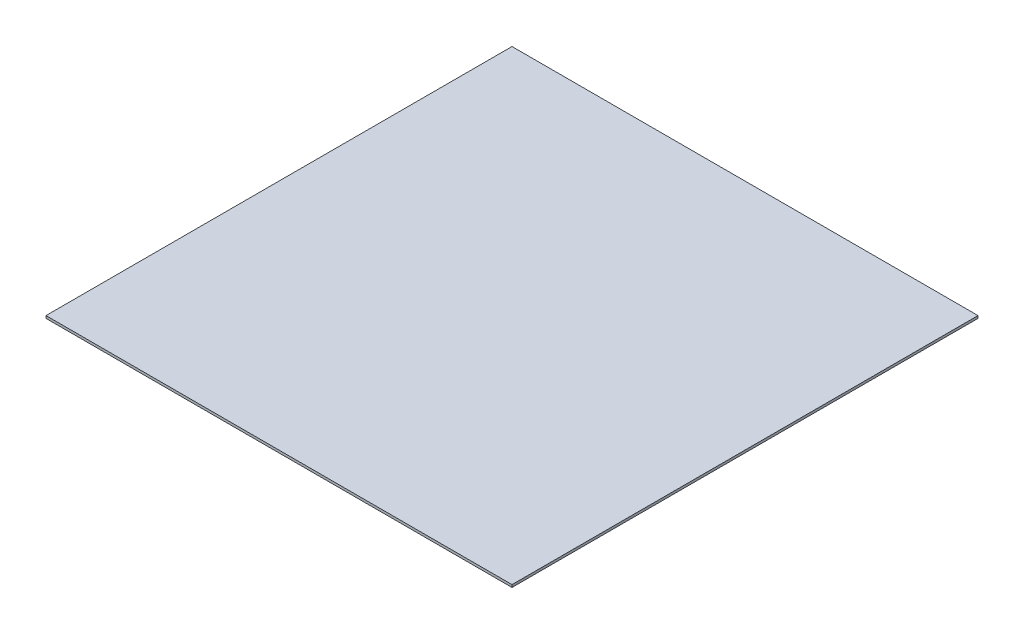
ISO-10303-21;
HEADER;
FILE_DESCRIPTION(('STEP AP214'),'2;1');
FILE_NAME('part.step','',(''),(''),'','','');
FILE_SCHEMA(('AUTOMOTIVE_DESIGN { 1 0 10303 214 1 1 1 1 }'));
ENDSEC;
DATA;
#1=APPLICATION_CONTEXT('core data for automotive mechanical design processes');
#2=APPLICATION_PROTOCOL_DEFINITION('international standard','automotive_design',2000,#1);
#3=PRODUCT_CONTEXT('',#1,'mechanical');
#4=PRODUCT('Part','Part','',(#3));
#5=PRODUCT_RELATED_PRODUCT_CATEGORY('part','',(#4));
#6=PRODUCT_DEFINITION_FORMATION('','',#4);
#7=PRODUCT_DEFINITION_CONTEXT('part definition',#1,'design');
#8=PRODUCT_DEFINITION('design','',#6,#7);
#9=PRODUCT_DEFINITION_SHAPE('','',#8);
#10=(LENGTH_UNIT() NAMED_UNIT(*) SI_UNIT(.MILLI.,.METRE.));
#11=(NAMED_UNIT(*) PLANE_ANGLE_UNIT() SI_UNIT($,.RADIAN.));
#12=(NAMED_UNIT(*) SI_UNIT($,.STERADIAN.) SOLID_ANGLE_UNIT());
#13=UNCERTAINTY_MEASURE_WITH_UNIT(LENGTH_MEASURE(1.E-05),#10,'distance_accuracy_value','');
#14=(GEOMETRIC_REPRESENTATION_CONTEXT(3) GLOBAL_UNCERTAINTY_ASSIGNED_CONTEXT((#13)) GLOBAL_UNIT_ASSIGNED_CONTEXT((#10,
#11,#12)) REPRESENTATION_CONTEXT('',''));
#15=CARTESIAN_POINT('',(0.,0.,0.));
#16=DIRECTION('',(0.,0.,1.));
#17=DIRECTION('',(1.,0.,0.));
#18=AXIS2_PLACEMENT_3D('',#15,#16,#17);
#19=CARTESIAN_POINT('',(750.,8.,750.));
#20=DIRECTION('',(-1.,0.,0.));
#21=DIRECTION('',(0.,0.,1.));
#22=AXIS2_PLACEMENT_3D('',#19,#20,#21);
#23=PLANE('',#22);
#24=DIRECTION('',(0.,0.,-1.));
#25=VECTOR('',#24,1.);
#26=CARTESIAN_POINT('',(750.,0.,750.));
#27=LINE('',#26,#25);
#28=CARTESIAN_POINT('',(750.,0.,750.));
#29=VERTEX_POINT('',#28);
#30=CARTESIAN_POINT('',(750.,0.,-750.));
#31=VERTEX_POINT('',#30);
#32=EDGE_CURVE('E99',#29,#31,#27,.T.);
#33=ORIENTED_EDGE('',*,*,#32,.T.);
#34=DIRECTION('',(0.,-1.,0.));
#35=VECTOR('',#34,1.);
#36=CARTESIAN_POINT('',(750.,8.,-750.));
#37=LINE('',#36,#35);
#38=CARTESIAN_POINT('',(750.,8.,-750.));
#39=VERTEX_POINT('',#38);
#40=EDGE_CURVE('E11',#39,#31,#37,.T.);
#41=ORIENTED_EDGE('',*,*,#40,.F.);
#42=DIRECTION('',(0.,0.,-1.));
#43=VECTOR('',#42,1.);
#44=CARTESIAN_POINT('',(750.,8.,750.));
#45=LINE('',#44,#43);
#46=CARTESIAN_POINT('',(750.,8.,750.));
#47=VERTEX_POINT('',#46);
#48=EDGE_CURVE('E87',#47,#39,#45,.T.);
#49=ORIENTED_EDGE('',*,*,#48,.F.);
#50=DIRECTION('',(0.,-1.,0.));
#51=VECTOR('',#50,1.);
#52=CARTESIAN_POINT('',(750.,8.,750.));
#53=LINE('',#52,#51);
#54=EDGE_CURVE('E95',#47,#29,#53,.T.);
#55=ORIENTED_EDGE('',*,*,#54,.T.);
#56=EDGE_LOOP('',(#33,#41,#49,#55));
#57=FACE_BOUND('',#56,.T.);
#58=ADVANCED_FACE('F36',(#57),#23,.F.);
#59=CARTESIAN_POINT('',(-750.,8.,-750.));
#60=DIRECTION('',(0.,0.,1.));
#61=DIRECTION('',(1.,0.,0.));
#62=AXIS2_PLACEMENT_3D('',#59,#60,#61);
#63=PLANE('',#62);
#64=DIRECTION('',(-1.,0.,0.));
#65=VECTOR('',#64,1.);
#66=CARTESIAN_POINT('',(-750.,0.,-750.));
#67=LINE('',#66,#65);
#68=CARTESIAN_POINT('',(-750.,0.,-750.));
#69=VERTEX_POINT('',#68);
#70=EDGE_CURVE('E91',#31,#69,#67,.T.);
#71=ORIENTED_EDGE('',*,*,#70,.T.);
#72=DIRECTION('',(0.,-1.,0.));
#73=VECTOR('',#72,1.);
#74=CARTESIAN_POINT('',(-750.,8.,-750.));
#75=LINE('',#74,#73);
#76=CARTESIAN_POINT('',(-750.,8.,-750.));
#77=VERTEX_POINT('',#76);
#78=EDGE_CURVE('E44',#77,#69,#75,.T.);
#79=ORIENTED_EDGE('',*,*,#78,.F.);
#80=DIRECTION('',(-1.,0.,0.));
#81=VECTOR('',#80,1.);
#82=CARTESIAN_POINT('',(-750.,8.,-750.));
#83=LINE('',#82,#81);
#84=EDGE_CURVE('E82',#39,#77,#83,.T.);
#85=ORIENTED_EDGE('',*,*,#84,.F.);
#86=ORIENTED_EDGE('',*,*,#40,.T.);
#87=EDGE_LOOP('',(#71,#79,#85,#86));
#88=FACE_BOUND('',#87,.T.);
#89=ADVANCED_FACE('F90',(#88),#63,.F.);
#90=CARTESIAN_POINT('',(-750.,8.,750.));
#91=DIRECTION('',(1.,0.,0.));
#92=DIRECTION('',(0.,0.,-1.));
#93=AXIS2_PLACEMENT_3D('',#90,#91,#92);
#94=PLANE('',#93);
#95=DIRECTION('',(0.,0.,1.));
#96=VECTOR('',#95,1.);
#97=CARTESIAN_POINT('',(-750.,0.,750.));
#98=LINE('',#97,#96);
#99=CARTESIAN_POINT('',(-750.,0.,750.));
#100=VERTEX_POINT('',#99);
#101=EDGE_CURVE('E69',#69,#100,#98,.T.);
#102=ORIENTED_EDGE('',*,*,#101,.T.);
#103=DIRECTION('',(0.,-1.,0.));
#104=VECTOR('',#103,1.);
#105=CARTESIAN_POINT('',(-750.,8.,750.));
#106=LINE('',#105,#104);
#107=CARTESIAN_POINT('',(-750.,8.,750.));
#108=VERTEX_POINT('',#107);
#109=EDGE_CURVE('E92',#108,#100,#106,.T.);
#110=ORIENTED_EDGE('',*,*,#109,.F.);
#111=DIRECTION('',(0.,0.,1.));
#112=VECTOR('',#111,1.);
#113=CARTESIAN_POINT('',(-750.,8.,750.));
#114=LINE('',#113,#112);
#115=EDGE_CURVE('E85',#77,#108,#114,.T.);
#116=ORIENTED_EDGE('',*,*,#115,.F.);
#117=ORIENTED_EDGE('',*,*,#78,.T.);
#118=EDGE_LOOP('',(#102,#110,#116,#117));
#119=FACE_BOUND('',#118,.T.);
#120=ADVANCED_FACE('F93',(#119),#94,.F.);
#121=CARTESIAN_POINT('',(-750.,8.,750.));
#122=DIRECTION('',(0.,0.,-1.));
#123=DIRECTION('',(-1.,0.,0.));
#124=AXIS2_PLACEMENT_3D('',#121,#122,#123);
#125=PLANE('',#124);
#126=DIRECTION('',(1.,0.,0.));
#127=VECTOR('',#126,1.);
#128=CARTESIAN_POINT('',(-750.,0.,750.));
#129=LINE('',#128,#127);
#130=EDGE_CURVE('E75',#100,#29,#129,.T.);
#131=ORIENTED_EDGE('',*,*,#130,.T.);
#132=ORIENTED_EDGE('',*,*,#54,.F.);
#133=DIRECTION('',(1.,0.,0.));
#134=VECTOR('',#133,1.);
#135=CARTESIAN_POINT('',(-750.,8.,750.));
#136=LINE('',#135,#134);
#137=EDGE_CURVE('E52',#108,#47,#136,.T.);
#138=ORIENTED_EDGE('',*,*,#137,.F.);
#139=ORIENTED_EDGE('',*,*,#109,.T.);
#140=EDGE_LOOP('',(#131,#132,#138,#139));
#141=FACE_BOUND('',#140,.T.);
#142=ADVANCED_FACE('F106',(#141),#125,.F.);
#143=CARTESIAN_POINT('',(0.,8.,0.));
#144=DIRECTION('',(0.,-1.,0.));
#145=DIRECTION('',(0.,0.,-1.));
#146=AXIS2_PLACEMENT_3D('',#143,#144,#145);
#147=PLANE('',#146);
#148=ORIENTED_EDGE('',*,*,#48,.T.);
#149=ORIENTED_EDGE('',*,*,#84,.T.);
#150=ORIENTED_EDGE('',*,*,#115,.T.);
#151=ORIENTED_EDGE('',*,*,#137,.T.);
#152=EDGE_LOOP('',(#148,#149,#150,#151));
#153=FACE_BOUND('',#152,.T.);
#154=ADVANCED_FACE('F83',(#153),#147,.F.);
#155=CARTESIAN_POINT('',(0.,0.,0.));
#156=DIRECTION('',(0.,-1.,0.));
#157=DIRECTION('',(0.,0.,-1.));
#158=AXIS2_PLACEMENT_3D('',#155,#156,#157);
#159=PLANE('',#158);
#160=ORIENTED_EDGE('',*,*,#32,.F.);
#161=ORIENTED_EDGE('',*,*,#130,.F.);
#162=ORIENTED_EDGE('',*,*,#101,.F.);
#163=ORIENTED_EDGE('',*,*,#70,.F.);
#164=EDGE_LOOP('',(#160,#161,#162,#163));
#165=FACE_BOUND('',#164,.T.);
#166=ADVANCED_FACE('F109',(#165),#159,.T.);
#167=CLOSED_SHELL('',(#58,#89,#120,#142,#154,#166));
#168=MANIFOLD_SOLID_BREP('B2',#167);
#169=ADVANCED_BREP_SHAPE_REPRESENTATION('',(#18,#168),#14);
#170=SHAPE_DEFINITION_REPRESENTATION(#9,#169);
ENDSEC;
END-ISO-10303-21;
